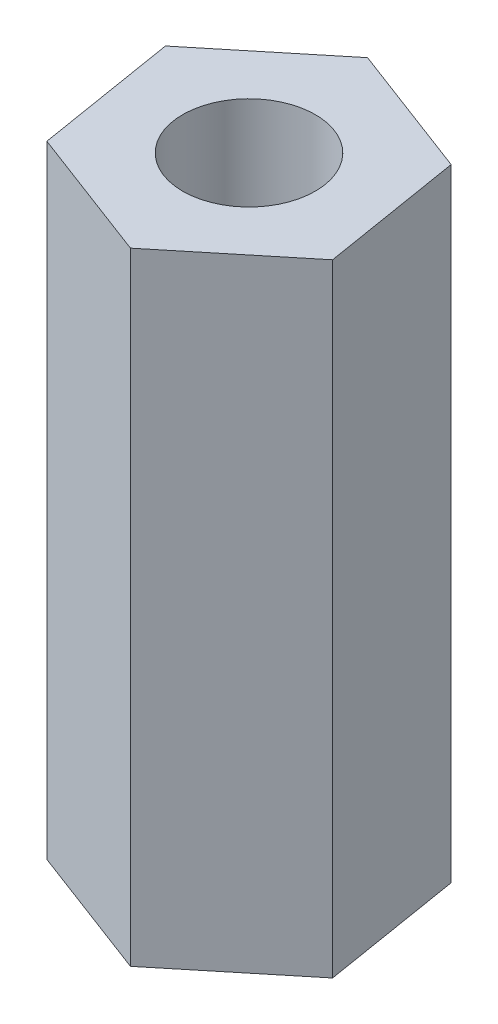
ISO-10303-21;
HEADER;
FILE_DESCRIPTION(('STEP AP214'),'2;1');
FILE_NAME('part.step','',(''),(''),'','','');
FILE_SCHEMA(('AUTOMOTIVE_DESIGN { 1 0 10303 214 1 1 1 1 }'));
ENDSEC;
DATA;
#1=APPLICATION_CONTEXT('core data for automotive mechanical design processes');
#2=APPLICATION_PROTOCOL_DEFINITION('international standard','automotive_design',2000,#1);
#3=PRODUCT_CONTEXT('',#1,'mechanical');
#4=PRODUCT('Part','Part','',(#3));
#5=PRODUCT_RELATED_PRODUCT_CATEGORY('part','',(#4));
#6=PRODUCT_DEFINITION_FORMATION('','',#4);
#7=PRODUCT_DEFINITION_CONTEXT('part definition',#1,'design');
#8=PRODUCT_DEFINITION('design','',#6,#7);
#9=PRODUCT_DEFINITION_SHAPE('','',#8);
#10=(LENGTH_UNIT() NAMED_UNIT(*) SI_UNIT(.MILLI.,.METRE.));
#11=(NAMED_UNIT(*) PLANE_ANGLE_UNIT() SI_UNIT($,.RADIAN.));
#12=(NAMED_UNIT(*) SI_UNIT($,.STERADIAN.) SOLID_ANGLE_UNIT());
#13=UNCERTAINTY_MEASURE_WITH_UNIT(LENGTH_MEASURE(1.E-05),#10,'distance_accuracy_value','');
#14=(GEOMETRIC_REPRESENTATION_CONTEXT(3) GLOBAL_UNCERTAINTY_ASSIGNED_CONTEXT((#13)) GLOBAL_UNIT_ASSIGNED_CONTEXT((#10,
#11,#12)) REPRESENTATION_CONTEXT('',''));
#15=CARTESIAN_POINT('',(0.,0.,0.));
#16=DIRECTION('',(0.,0.,1.));
#17=DIRECTION('',(1.,0.,0.));
#18=AXIS2_PLACEMENT_3D('',#15,#16,#17);
#19=CARTESIAN_POINT('',(0.,15.,0.));
#20=DIRECTION('',(0.,1.,0.));
#21=DIRECTION('',(0.,0.,1.));
#22=AXIS2_PLACEMENT_3D('',#19,#20,#21);
#23=PLANE('',#22);
#24=DIRECTION('',(0.935402743193896,0.,0.353584089044366));
#25=VECTOR('',#24,1.);
#26=CARTESIAN_POINT('',(-2.68091734388423,15.,2.19378262260889));
#27=LINE('',#26,#25);
#28=CARTESIAN_POINT('',(-2.68091734388423,15.,2.19378262260889));
#29=VERTEX_POINT('',#28);
#30=CARTESIAN_POINT('',(0.559412809618033,15.,3.41863383655449));
#31=VERTEX_POINT('',#30);
#32=EDGE_CURVE('E150',#29,#31,#27,.T.);
#33=ORIENTED_EDGE('',*,*,#32,.T.);
#34=DIRECTION('',(0.773914175083348,0.,-0.633290493853383));
#35=VECTOR('',#34,1.);
#36=CARTESIAN_POINT('',(0.559412809618033,15.,3.41863383655449));
#37=LINE('',#36,#35);
#38=CARTESIAN_POINT('',(3.24033015350226,15.,1.2248512139456));
#39=VERTEX_POINT('',#38);
#40=EDGE_CURVE('E98',#31,#39,#37,.T.);
#41=ORIENTED_EDGE('',*,*,#40,.T.);
#42=DIRECTION('',(-0.161488568110548,0.,-0.986874582897748));
#43=VECTOR('',#42,1.);
#44=CARTESIAN_POINT('',(3.24033015350226,15.,1.2248512139456));
#45=LINE('',#44,#43);
#46=CARTESIAN_POINT('',(2.68091734388423,15.,-2.19378262260889));
#47=VERTEX_POINT('',#46);
#48=EDGE_CURVE('E111',#39,#47,#45,.T.);
#49=ORIENTED_EDGE('',*,*,#48,.T.);
#50=DIRECTION('',(-0.935402743193896,0.,-0.353584089044366));
#51=VECTOR('',#50,1.);
#52=CARTESIAN_POINT('',(2.68091734388423,15.,-2.19378262260889));
#53=LINE('',#52,#51);
#54=CARTESIAN_POINT('',(-0.559412809618034,15.,-3.41863383655449));
#55=VERTEX_POINT('',#54);
#56=EDGE_CURVE('E105',#47,#55,#53,.T.);
#57=ORIENTED_EDGE('',*,*,#56,.T.);
#58=DIRECTION('',(-0.773914175083348,0.,0.633290493853383));
#59=VECTOR('',#58,1.);
#60=CARTESIAN_POINT('',(-0.559412809618034,15.,-3.41863383655449));
#61=LINE('',#60,#59);
#62=CARTESIAN_POINT('',(-3.24033015350226,15.,-1.2248512139456));
#63=VERTEX_POINT('',#62);
#64=EDGE_CURVE('E109',#55,#63,#61,.T.);
#65=ORIENTED_EDGE('',*,*,#64,.T.);
#66=DIRECTION('',(0.161488568110548,0.,0.986874582897748));
#67=VECTOR('',#66,1.);
#68=CARTESIAN_POINT('',(-3.24033015350226,15.,-1.2248512139456));
#69=LINE('',#68,#67);
#70=EDGE_CURVE('E61',#63,#29,#69,.T.);
#71=ORIENTED_EDGE('',*,*,#70,.T.);
#72=EDGE_LOOP('',(#33,#41,#49,#57,#65,#71));
#73=FACE_BOUND('',#72,.T.);
#74=CARTESIAN_POINT('',(0.,15.,0.));
#75=DIRECTION('',(0.,1.,0.));
#76=DIRECTION('',(0.,0.,1.));
#77=AXIS2_PLACEMENT_3D('',#74,#75,#76);
#78=CIRCLE('',#77,1.6);
#79=CARTESIAN_POINT('',(0.,15.,1.6));
#80=VERTEX_POINT('',#79);
#81=EDGE_CURVE('E138',#80,#80,#78,.T.);
#82=ORIENTED_EDGE('',*,*,#81,.F.);
#83=EDGE_LOOP('',(#82));
#84=FACE_BOUND('',#83,.T.);
#85=ADVANCED_FACE('F43',(#73,#84),#23,.T.);
#86=CARTESIAN_POINT('',(0.,0.,0.));
#87=DIRECTION('',(0.,1.,0.));
#88=DIRECTION('',(0.,0.,1.));
#89=AXIS2_PLACEMENT_3D('',#86,#87,#88);
#90=PLANE('',#89);
#91=DIRECTION('',(0.935402743193896,0.,0.353584089044366));
#92=VECTOR('',#91,1.);
#93=CARTESIAN_POINT('',(-2.68091734388423,0.,2.19378262260889));
#94=LINE('',#93,#92);
#95=CARTESIAN_POINT('',(-2.68091734388423,0.,2.19378262260889));
#96=VERTEX_POINT('',#95);
#97=CARTESIAN_POINT('',(0.559412809618033,0.,3.41863383655449));
#98=VERTEX_POINT('',#97);
#99=EDGE_CURVE('E133',#96,#98,#94,.T.);
#100=ORIENTED_EDGE('',*,*,#99,.F.);
#101=DIRECTION('',(0.161488568110548,0.,0.986874582897748));
#102=VECTOR('',#101,1.);
#103=CARTESIAN_POINT('',(-3.24033015350226,0.,-1.2248512139456));
#104=LINE('',#103,#102);
#105=CARTESIAN_POINT('',(-3.24033015350226,0.,-1.2248512139456));
#106=VERTEX_POINT('',#105);
#107=EDGE_CURVE('E90',#106,#96,#104,.T.);
#108=ORIENTED_EDGE('',*,*,#107,.F.);
#109=DIRECTION('',(-0.773914175083348,0.,0.633290493853383));
#110=VECTOR('',#109,1.);
#111=CARTESIAN_POINT('',(-0.559412809618034,0.,-3.41863383655449));
#112=LINE('',#111,#110);
#113=CARTESIAN_POINT('',(-0.559412809618034,0.,-3.41863383655449));
#114=VERTEX_POINT('',#113);
#115=EDGE_CURVE('E84',#114,#106,#112,.T.);
#116=ORIENTED_EDGE('',*,*,#115,.F.);
#117=DIRECTION('',(-0.935402743193896,0.,-0.353584089044366));
#118=VECTOR('',#117,1.);
#119=CARTESIAN_POINT('',(2.68091734388423,0.,-2.19378262260889));
#120=LINE('',#119,#118);
#121=CARTESIAN_POINT('',(2.68091734388423,0.,-2.19378262260889));
#122=VERTEX_POINT('',#121);
#123=EDGE_CURVE('E120',#122,#114,#120,.T.);
#124=ORIENTED_EDGE('',*,*,#123,.F.);
#125=DIRECTION('',(-0.161488568110548,0.,-0.986874582897748));
#126=VECTOR('',#125,1.);
#127=CARTESIAN_POINT('',(3.24033015350226,0.,1.2248512139456));
#128=LINE('',#127,#126);
#129=CARTESIAN_POINT('',(3.24033015350226,0.,1.2248512139456));
#130=VERTEX_POINT('',#129);
#131=EDGE_CURVE('E141',#130,#122,#128,.T.);
#132=ORIENTED_EDGE('',*,*,#131,.F.);
#133=DIRECTION('',(0.773914175083348,0.,-0.633290493853383));
#134=VECTOR('',#133,1.);
#135=CARTESIAN_POINT('',(0.559412809618033,0.,3.41863383655449));
#136=LINE('',#135,#134);
#137=EDGE_CURVE('E137',#98,#130,#136,.T.);
#138=ORIENTED_EDGE('',*,*,#137,.F.);
#139=EDGE_LOOP('',(#100,#108,#116,#124,#132,#138));
#140=FACE_BOUND('',#139,.T.);
#141=CARTESIAN_POINT('',(0.,0.,0.));
#142=DIRECTION('',(0.,1.,0.));
#143=DIRECTION('',(0.,0.,1.));
#144=AXIS2_PLACEMENT_3D('',#141,#142,#143);
#145=CIRCLE('',#144,1.6);
#146=CARTESIAN_POINT('',(0.,0.,1.6));
#147=VERTEX_POINT('',#146);
#148=EDGE_CURVE('E265',#147,#147,#145,.T.);
#149=ORIENTED_EDGE('',*,*,#148,.T.);
#150=EDGE_LOOP('',(#149));
#151=FACE_BOUND('',#150,.T.);
#152=ADVANCED_FACE('F163',(#140,#151),#90,.F.);
#153=CARTESIAN_POINT('',(-2.68091734388423,15.,2.19378262260889));
#154=DIRECTION('',(0.353584089044366,0.,-0.935402743193896));
#155=DIRECTION('',(-0.935402743193896,0.,-0.353584089044366));
#156=AXIS2_PLACEMENT_3D('',#153,#154,#155);
#157=PLANE('',#156);
#158=ORIENTED_EDGE('',*,*,#99,.T.);
#159=DIRECTION('',(0.,-1.,0.));
#160=VECTOR('',#159,1.);
#161=CARTESIAN_POINT('',(0.559412809618033,15.,3.41863383655449));
#162=LINE('',#161,#160);
#163=EDGE_CURVE('E11',#31,#98,#162,.T.);
#164=ORIENTED_EDGE('',*,*,#163,.F.);
#165=ORIENTED_EDGE('',*,*,#32,.F.);
#166=DIRECTION('',(0.,-1.,0.));
#167=VECTOR('',#166,1.);
#168=CARTESIAN_POINT('',(-2.68091734388423,15.,2.19378262260889));
#169=LINE('',#168,#167);
#170=EDGE_CURVE('E129',#29,#96,#169,.T.);
#171=ORIENTED_EDGE('',*,*,#170,.T.);
#172=EDGE_LOOP('',(#158,#164,#165,#171));
#173=FACE_BOUND('',#172,.T.);
#174=ADVANCED_FACE('F45',(#173),#157,.F.);
#175=CARTESIAN_POINT('',(0.559412809618033,15.,3.41863383655449));
#176=DIRECTION('',(-0.633290493853383,0.,-0.773914175083348));
#177=DIRECTION('',(-0.773914175083348,0.,0.633290493853383));
#178=AXIS2_PLACEMENT_3D('',#175,#176,#177);
#179=PLANE('',#178);
#180=ORIENTED_EDGE('',*,*,#137,.T.);
#181=DIRECTION('',(0.,-1.,0.));
#182=VECTOR('',#181,1.);
#183=CARTESIAN_POINT('',(3.24033015350226,15.,1.2248512139456));
#184=LINE('',#183,#182);
#185=EDGE_CURVE('E53',#39,#130,#184,.T.);
#186=ORIENTED_EDGE('',*,*,#185,.F.);
#187=ORIENTED_EDGE('',*,*,#40,.F.);
#188=ORIENTED_EDGE('',*,*,#163,.T.);
#189=EDGE_LOOP('',(#180,#186,#187,#188));
#190=FACE_BOUND('',#189,.T.);
#191=ADVANCED_FACE('F188',(#190),#179,.F.);
#192=CARTESIAN_POINT('',(3.24033015350226,15.,1.2248512139456));
#193=DIRECTION('',(-0.986874582897748,0.,0.161488568110548));
#194=DIRECTION('',(0.161488568110548,0.,0.986874582897748));
#195=AXIS2_PLACEMENT_3D('',#192,#193,#194);
#196=PLANE('',#195);
#197=ORIENTED_EDGE('',*,*,#131,.T.);
#198=DIRECTION('',(0.,-1.,0.));
#199=VECTOR('',#198,1.);
#200=CARTESIAN_POINT('',(2.68091734388423,15.,-2.19378262260889));
#201=LINE('',#200,#199);
#202=EDGE_CURVE('E122',#47,#122,#201,.T.);
#203=ORIENTED_EDGE('',*,*,#202,.F.);
#204=ORIENTED_EDGE('',*,*,#48,.F.);
#205=ORIENTED_EDGE('',*,*,#185,.T.);
#206=EDGE_LOOP('',(#197,#203,#204,#205));
#207=FACE_BOUND('',#206,.T.);
#208=ADVANCED_FACE('F160',(#207),#196,.F.);
#209=CARTESIAN_POINT('',(2.68091734388423,15.,-2.19378262260889));
#210=DIRECTION('',(-0.353584089044366,0.,0.935402743193896));
#211=DIRECTION('',(0.935402743193896,0.,0.353584089044366));
#212=AXIS2_PLACEMENT_3D('',#209,#210,#211);
#213=PLANE('',#212);
#214=ORIENTED_EDGE('',*,*,#123,.T.);
#215=DIRECTION('',(0.,-1.,0.));
#216=VECTOR('',#215,1.);
#217=CARTESIAN_POINT('',(-0.559412809618034,15.,-3.41863383655449));
#218=LINE('',#217,#216);
#219=EDGE_CURVE('E117',#55,#114,#218,.T.);
#220=ORIENTED_EDGE('',*,*,#219,.F.);
#221=ORIENTED_EDGE('',*,*,#56,.F.);
#222=ORIENTED_EDGE('',*,*,#202,.T.);
#223=EDGE_LOOP('',(#214,#220,#221,#222));
#224=FACE_BOUND('',#223,.T.);
#225=ADVANCED_FACE('F118',(#224),#213,.F.);
#226=CARTESIAN_POINT('',(-0.559412809618034,15.,-3.41863383655449));
#227=DIRECTION('',(0.633290493853383,0.,0.773914175083348));
#228=DIRECTION('',(0.773914175083348,0.,-0.633290493853383));
#229=AXIS2_PLACEMENT_3D('',#226,#227,#228);
#230=PLANE('',#229);
#231=ORIENTED_EDGE('',*,*,#115,.T.);
#232=DIRECTION('',(0.,-1.,0.));
#233=VECTOR('',#232,1.);
#234=CARTESIAN_POINT('',(-3.24033015350226,15.,-1.2248512139456));
#235=LINE('',#234,#233);
#236=EDGE_CURVE('E123',#63,#106,#235,.T.);
#237=ORIENTED_EDGE('',*,*,#236,.F.);
#238=ORIENTED_EDGE('',*,*,#64,.F.);
#239=ORIENTED_EDGE('',*,*,#219,.T.);
#240=EDGE_LOOP('',(#231,#237,#238,#239));
#241=FACE_BOUND('',#240,.T.);
#242=ADVANCED_FACE('F125',(#241),#230,.F.);
#243=CARTESIAN_POINT('',(-3.24033015350226,15.,-1.2248512139456));
#244=DIRECTION('',(0.986874582897748,0.,-0.161488568110548));
#245=DIRECTION('',(-0.161488568110548,0.,-0.986874582897748));
#246=AXIS2_PLACEMENT_3D('',#243,#244,#245);
#247=PLANE('',#246);
#248=ORIENTED_EDGE('',*,*,#107,.T.);
#249=ORIENTED_EDGE('',*,*,#170,.F.);
#250=ORIENTED_EDGE('',*,*,#70,.F.);
#251=ORIENTED_EDGE('',*,*,#236,.T.);
#252=EDGE_LOOP('',(#248,#249,#250,#251));
#253=FACE_BOUND('',#252,.T.);
#254=ADVANCED_FACE('F168',(#253),#247,.F.);
#255=CARTESIAN_POINT('',(0.,15.,0.));
#256=DIRECTION('',(0.,-1.,0.));
#257=DIRECTION('',(0.,0.,-1.));
#258=AXIS2_PLACEMENT_3D('',#255,#256,#257);
#259=CYLINDRICAL_SURFACE('',#258,1.6);
#260=ORIENTED_EDGE('',*,*,#81,.T.);
#261=EDGE_LOOP('',(#260));
#262=FACE_BOUND('',#261,.T.);
#263=ORIENTED_EDGE('',*,*,#148,.F.);
#264=EDGE_LOOP('',(#263));
#265=FACE_BOUND('',#264,.T.);
#266=ADVANCED_FACE('F170',(#262,#265),#259,.F.);
#267=CLOSED_SHELL('',(#85,#152,#174,#191,#208,#225,#242,#254,#266));
#268=MANIFOLD_SOLID_BREP('B2',#267);
#269=ADVANCED_BREP_SHAPE_REPRESENTATION('',(#18,#268),#14);
#270=SHAPE_DEFINITION_REPRESENTATION(#9,#269);
ENDSEC;
END-ISO-10303-21;
